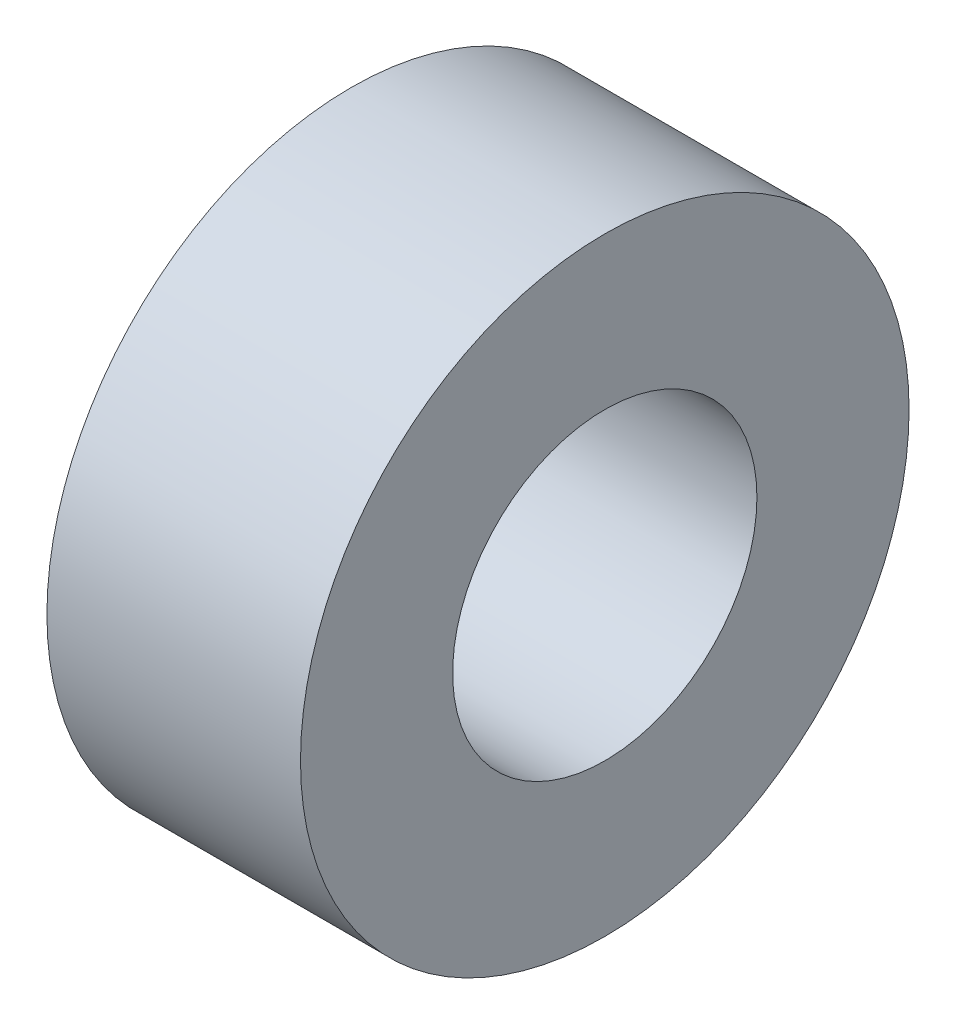
ISO-10303-21;
HEADER;
FILE_DESCRIPTION(('STEP AP214'),'2;1');
FILE_NAME('part.step','',(''),(''),'','','');
FILE_SCHEMA(('AUTOMOTIVE_DESIGN { 1 0 10303 214 1 1 1 1 }'));
ENDSEC;
DATA;
#1=APPLICATION_CONTEXT('core data for automotive mechanical design processes');
#2=APPLICATION_PROTOCOL_DEFINITION('international standard','automotive_design',2000,#1);
#3=PRODUCT_CONTEXT('',#1,'mechanical');
#4=PRODUCT('Part','Part','',(#3));
#5=PRODUCT_RELATED_PRODUCT_CATEGORY('part','',(#4));
#6=PRODUCT_DEFINITION_FORMATION('','',#4);
#7=PRODUCT_DEFINITION_CONTEXT('part definition',#1,'design');
#8=PRODUCT_DEFINITION('design','',#6,#7);
#9=PRODUCT_DEFINITION_SHAPE('','',#8);
#10=(LENGTH_UNIT() NAMED_UNIT(*) SI_UNIT(.MILLI.,.METRE.));
#11=(NAMED_UNIT(*) PLANE_ANGLE_UNIT() SI_UNIT($,.RADIAN.));
#12=(NAMED_UNIT(*) SI_UNIT($,.STERADIAN.) SOLID_ANGLE_UNIT());
#13=UNCERTAINTY_MEASURE_WITH_UNIT(LENGTH_MEASURE(1.E-05),#10,'distance_accuracy_value','');
#14=(GEOMETRIC_REPRESENTATION_CONTEXT(3) GLOBAL_UNCERTAINTY_ASSIGNED_CONTEXT((#13)) GLOBAL_UNIT_ASSIGNED_CONTEXT((#10,
#11,#12)) REPRESENTATION_CONTEXT('',''));
#15=CARTESIAN_POINT('',(0.,0.,0.));
#16=DIRECTION('',(0.,0.,1.));
#17=DIRECTION('',(1.,0.,0.));
#18=AXIS2_PLACEMENT_3D('',#15,#16,#17);
#19=CARTESIAN_POINT('',(2.5,0.,0.));
#20=DIRECTION('',(1.,0.,0.));
#21=DIRECTION('',(0.,0.,-1.));
#22=AXIS2_PLACEMENT_3D('',#19,#20,#21);
#23=PLANE('',#22);
#24=CARTESIAN_POINT('',(2.5,0.,0.));
#25=DIRECTION('',(1.,0.,0.));
#26=DIRECTION('',(0.,0.,-1.));
#27=AXIS2_PLACEMENT_3D('',#24,#25,#26);
#28=CIRCLE('',#27,3.);
#29=CARTESIAN_POINT('',(2.5,0.,-3.));
#30=VERTEX_POINT('',#29);
#31=EDGE_CURVE('E10',#30,#30,#28,.T.);
#32=ORIENTED_EDGE('',*,*,#31,.T.);
#33=EDGE_LOOP('',(#32));
#34=FACE_BOUND('',#33,.T.);
#35=CARTESIAN_POINT('',(2.5,0.,0.));
#36=DIRECTION('',(1.,0.,0.));
#37=DIRECTION('',(0.,0.,-1.));
#38=AXIS2_PLACEMENT_3D('',#35,#36,#37);
#39=CIRCLE('',#38,1.5);
#40=CARTESIAN_POINT('',(2.5,0.,-1.5));
#41=VERTEX_POINT('',#40);
#42=EDGE_CURVE('E46',#41,#41,#39,.T.);
#43=ORIENTED_EDGE('',*,*,#42,.F.);
#44=EDGE_LOOP('',(#43));
#45=FACE_BOUND('',#44,.T.);
#46=ADVANCED_FACE('F35',(#34,#45),#23,.T.);
#47=CARTESIAN_POINT('',(0.,0.,0.));
#48=DIRECTION('',(1.,0.,0.));
#49=DIRECTION('',(0.,0.,-1.));
#50=AXIS2_PLACEMENT_3D('',#47,#48,#49);
#51=PLANE('',#50);
#52=CARTESIAN_POINT('',(0.,0.,0.));
#53=DIRECTION('',(1.,0.,0.));
#54=DIRECTION('',(0.,0.,-1.));
#55=AXIS2_PLACEMENT_3D('',#52,#53,#54);
#56=CIRCLE('',#55,3.);
#57=CARTESIAN_POINT('',(0.,0.,-3.));
#58=VERTEX_POINT('',#57);
#59=EDGE_CURVE('E39',#58,#58,#56,.T.);
#60=ORIENTED_EDGE('',*,*,#59,.F.);
#61=EDGE_LOOP('',(#60));
#62=FACE_BOUND('',#61,.T.);
#63=CARTESIAN_POINT('',(0.,0.,0.));
#64=DIRECTION('',(1.,0.,0.));
#65=DIRECTION('',(0.,0.,-1.));
#66=AXIS2_PLACEMENT_3D('',#63,#64,#65);
#67=CIRCLE('',#66,1.5);
#68=CARTESIAN_POINT('',(0.,0.,-1.5));
#69=VERTEX_POINT('',#68);
#70=EDGE_CURVE('E48',#69,#69,#67,.T.);
#71=ORIENTED_EDGE('',*,*,#70,.T.);
#72=EDGE_LOOP('',(#71));
#73=FACE_BOUND('',#72,.T.);
#74=ADVANCED_FACE('F58',(#62,#73),#51,.F.);
#75=CARTESIAN_POINT('',(2.5,0.,0.));
#76=DIRECTION('',(-1.,0.,0.));
#77=DIRECTION('',(0.,0.,1.));
#78=AXIS2_PLACEMENT_3D('',#75,#76,#77);
#79=CYLINDRICAL_SURFACE('',#78,3.);
#80=ORIENTED_EDGE('',*,*,#31,.F.);
#81=EDGE_LOOP('',(#80));
#82=FACE_BOUND('',#81,.T.);
#83=ORIENTED_EDGE('',*,*,#59,.T.);
#84=EDGE_LOOP('',(#83));
#85=FACE_BOUND('',#84,.T.);
#86=ADVANCED_FACE('F37',(#82,#85),#79,.T.);
#87=CARTESIAN_POINT('',(2.5,0.,0.));
#88=DIRECTION('',(-1.,0.,0.));
#89=DIRECTION('',(0.,0.,1.));
#90=AXIS2_PLACEMENT_3D('',#87,#88,#89);
#91=CYLINDRICAL_SURFACE('',#90,1.5);
#92=ORIENTED_EDGE('',*,*,#42,.T.);
#93=EDGE_LOOP('',(#92));
#94=FACE_BOUND('',#93,.T.);
#95=ORIENTED_EDGE('',*,*,#70,.F.);
#96=EDGE_LOOP('',(#95));
#97=FACE_BOUND('',#96,.T.);
#98=ADVANCED_FACE('F54',(#94,#97),#91,.F.);
#99=CLOSED_SHELL('',(#46,#74,#86,#98));
#100=MANIFOLD_SOLID_BREP('B2',#99);
#101=ADVANCED_BREP_SHAPE_REPRESENTATION('',(#18,#100),#14);
#102=SHAPE_DEFINITION_REPRESENTATION(#9,#101);
ENDSEC;
END-ISO-10303-21;
